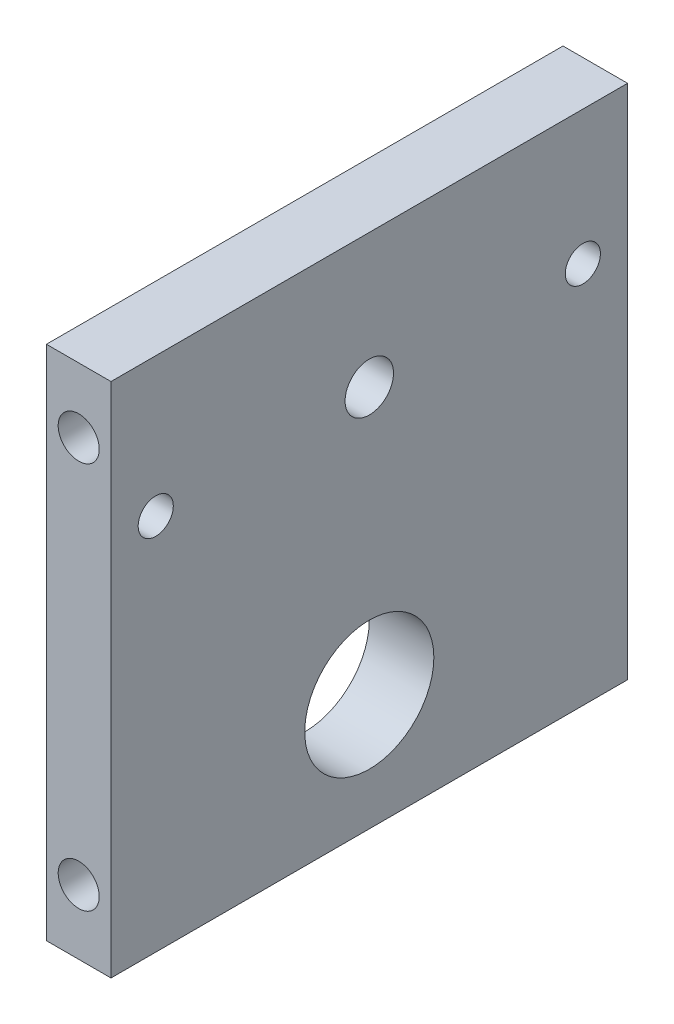
ISO-10303-21;
HEADER;
FILE_DESCRIPTION(('STEP AP214'),'2;1');
FILE_NAME('part.step','',(''),(''),'','','');
FILE_SCHEMA(('AUTOMOTIVE_DESIGN { 1 0 10303 214 1 1 1 1 }'));
ENDSEC;
DATA;
#1=APPLICATION_CONTEXT('core data for automotive mechanical design processes');
#2=APPLICATION_PROTOCOL_DEFINITION('international standard','automotive_design',2000,#1);
#3=PRODUCT_CONTEXT('',#1,'mechanical');
#4=PRODUCT('Part','Part','',(#3));
#5=PRODUCT_RELATED_PRODUCT_CATEGORY('part','',(#4));
#6=PRODUCT_DEFINITION_FORMATION('','',#4);
#7=PRODUCT_DEFINITION_CONTEXT('part definition',#1,'design');
#8=PRODUCT_DEFINITION('design','',#6,#7);
#9=PRODUCT_DEFINITION_SHAPE('','',#8);
#10=(LENGTH_UNIT() NAMED_UNIT(*) SI_UNIT(.MILLI.,.METRE.));
#11=(NAMED_UNIT(*) PLANE_ANGLE_UNIT() SI_UNIT($,.RADIAN.));
#12=(NAMED_UNIT(*) SI_UNIT($,.STERADIAN.) SOLID_ANGLE_UNIT());
#13=UNCERTAINTY_MEASURE_WITH_UNIT(LENGTH_MEASURE(1.E-05),#10,'distance_accuracy_value','');
#14=(GEOMETRIC_REPRESENTATION_CONTEXT(3) GLOBAL_UNCERTAINTY_ASSIGNED_CONTEXT((#13)) GLOBAL_UNIT_ASSIGNED_CONTEXT((#10,
#11,#12)) REPRESENTATION_CONTEXT('',''));
#15=CARTESIAN_POINT('',(0.,0.,0.));
#16=DIRECTION('',(0.,0.,1.));
#17=DIRECTION('',(1.,0.,0.));
#18=AXIS2_PLACEMENT_3D('',#15,#16,#17);
#19=CARTESIAN_POINT('',(6.35,-25.4,-25.4));
#20=DIRECTION('',(0.,0.,1.));
#21=DIRECTION('',(1.,0.,0.));
#22=AXIS2_PLACEMENT_3D('',#19,#20,#21);
#23=PLANE('',#22);
#24=DIRECTION('',(0.,1.,0.));
#25=VECTOR('',#24,1.);
#26=CARTESIAN_POINT('',(0.,-25.4,-25.4));
#27=LINE('',#26,#25);
#28=CARTESIAN_POINT('',(0.,-25.4,-25.4));
#29=VERTEX_POINT('',#28);
#30=CARTESIAN_POINT('',(0.,25.4,-25.4));
#31=VERTEX_POINT('',#30);
#32=EDGE_CURVE('E138',#29,#31,#27,.T.);
#33=ORIENTED_EDGE('',*,*,#32,.T.);
#34=DIRECTION('',(-1.,0.,0.));
#35=VECTOR('',#34,1.);
#36=CARTESIAN_POINT('',(6.35,25.4,-25.4));
#37=LINE('',#36,#35);
#38=CARTESIAN_POINT('',(6.35,25.4,-25.4));
#39=VERTEX_POINT('',#38);
#40=EDGE_CURVE('E11',#39,#31,#37,.T.);
#41=ORIENTED_EDGE('',*,*,#40,.F.);
#42=DIRECTION('',(0.,1.,0.));
#43=VECTOR('',#42,1.);
#44=CARTESIAN_POINT('',(6.35,-25.4,-25.4));
#45=LINE('',#44,#43);
#46=CARTESIAN_POINT('',(6.35,-25.4,-25.4));
#47=VERTEX_POINT('',#46);
#48=EDGE_CURVE('E139',#47,#39,#45,.T.);
#49=ORIENTED_EDGE('',*,*,#48,.F.);
#50=DIRECTION('',(-1.,0.,0.));
#51=VECTOR('',#50,1.);
#52=CARTESIAN_POINT('',(6.35,-25.4,-25.4));
#53=LINE('',#52,#51);
#54=EDGE_CURVE('E145',#47,#29,#53,.T.);
#55=ORIENTED_EDGE('',*,*,#54,.T.);
#56=EDGE_LOOP('',(#33,#41,#49,#55));
#57=FACE_BOUND('',#56,.T.);
#58=ADVANCED_FACE('F39',(#57),#23,.F.);
#59=CARTESIAN_POINT('',(6.35,25.4,25.4));
#60=DIRECTION('',(0.,-1.,0.));
#61=DIRECTION('',(0.,0.,-1.));
#62=AXIS2_PLACEMENT_3D('',#59,#60,#61);
#63=PLANE('',#62);
#64=DIRECTION('',(0.,0.,1.));
#65=VECTOR('',#64,1.);
#66=CARTESIAN_POINT('',(0.,25.4,25.4));
#67=LINE('',#66,#65);
#68=CARTESIAN_POINT('',(0.,25.4,25.4));
#69=VERTEX_POINT('',#68);
#70=EDGE_CURVE('E148',#31,#69,#67,.T.);
#71=ORIENTED_EDGE('',*,*,#70,.T.);
#72=DIRECTION('',(-1.,0.,0.));
#73=VECTOR('',#72,1.);
#74=CARTESIAN_POINT('',(6.35,25.4,25.4));
#75=LINE('',#74,#73);
#76=CARTESIAN_POINT('',(6.35,25.4,25.4));
#77=VERTEX_POINT('',#76);
#78=EDGE_CURVE('E47',#77,#69,#75,.T.);
#79=ORIENTED_EDGE('',*,*,#78,.F.);
#80=DIRECTION('',(0.,0.,1.));
#81=VECTOR('',#80,1.);
#82=CARTESIAN_POINT('',(6.35,25.4,25.4));
#83=LINE('',#82,#81);
#84=EDGE_CURVE('E86',#39,#77,#83,.T.);
#85=ORIENTED_EDGE('',*,*,#84,.F.);
#86=ORIENTED_EDGE('',*,*,#40,.T.);
#87=EDGE_LOOP('',(#71,#79,#85,#86));
#88=FACE_BOUND('',#87,.T.);
#89=ADVANCED_FACE('F172',(#88),#63,.F.);
#90=CARTESIAN_POINT('',(6.35,-25.4,25.4));
#91=DIRECTION('',(0.,0.,-1.));
#92=DIRECTION('',(-1.,0.,0.));
#93=AXIS2_PLACEMENT_3D('',#90,#91,#92);
#94=PLANE('',#93);
#95=CARTESIAN_POINT('',(3.17499999999999,-19.05,25.4));
#96=DIRECTION('',(0.,0.,1.));
#97=DIRECTION('',(1.,0.,0.));
#98=AXIS2_PLACEMENT_3D('',#95,#96,#97);
#99=CIRCLE('',#98,2.0193);
#100=CARTESIAN_POINT('',(5.19429999999999,-19.05,25.4));
#101=VERTEX_POINT('',#100);
#102=EDGE_CURVE('E104',#101,#101,#99,.T.);
#103=ORIENTED_EDGE('',*,*,#102,.F.);
#104=EDGE_LOOP('',(#103));
#105=FACE_BOUND('',#104,.T.);
#106=CARTESIAN_POINT('',(3.175,19.05,25.4));
#107=DIRECTION('',(0.,0.,1.));
#108=DIRECTION('',(1.,0.,0.));
#109=AXIS2_PLACEMENT_3D('',#106,#107,#108);
#110=CIRCLE('',#109,2.0193);
#111=CARTESIAN_POINT('',(5.1943,19.05,25.4));
#112=VERTEX_POINT('',#111);
#113=EDGE_CURVE('E103',#112,#112,#110,.T.);
#114=ORIENTED_EDGE('',*,*,#113,.F.);
#115=EDGE_LOOP('',(#114));
#116=FACE_BOUND('',#115,.T.);
#117=DIRECTION('',(0.,-1.,0.));
#118=VECTOR('',#117,1.);
#119=CARTESIAN_POINT('',(0.,-25.4,25.4));
#120=LINE('',#119,#118);
#121=CARTESIAN_POINT('',(0.,-25.4,25.4));
#122=VERTEX_POINT('',#121);
#123=EDGE_CURVE('E73',#69,#122,#120,.T.);
#124=ORIENTED_EDGE('',*,*,#123,.T.);
#125=DIRECTION('',(-1.,0.,0.));
#126=VECTOR('',#125,1.);
#127=CARTESIAN_POINT('',(6.35,-25.4,25.4));
#128=LINE('',#127,#126);
#129=CARTESIAN_POINT('',(6.35,-25.4,25.4));
#130=VERTEX_POINT('',#129);
#131=EDGE_CURVE('E153',#130,#122,#128,.T.);
#132=ORIENTED_EDGE('',*,*,#131,.F.);
#133=DIRECTION('',(0.,-1.,0.));
#134=VECTOR('',#133,1.);
#135=CARTESIAN_POINT('',(6.35,-25.4,25.4));
#136=LINE('',#135,#134);
#137=EDGE_CURVE('E142',#77,#130,#136,.T.);
#138=ORIENTED_EDGE('',*,*,#137,.F.);
#139=ORIENTED_EDGE('',*,*,#78,.T.);
#140=EDGE_LOOP('',(#124,#132,#138,#139));
#141=FACE_BOUND('',#140,.T.);
#142=ADVANCED_FACE('F155',(#105,#116,#141),#94,.F.);
#143=CARTESIAN_POINT('',(6.35,-25.4,25.4));
#144=DIRECTION('',(0.,1.,0.));
#145=DIRECTION('',(0.,0.,1.));
#146=AXIS2_PLACEMENT_3D('',#143,#144,#145);
#147=PLANE('',#146);
#148=DIRECTION('',(0.,0.,-1.));
#149=VECTOR('',#148,1.);
#150=CARTESIAN_POINT('',(0.,-25.4,25.4));
#151=LINE('',#150,#149);
#152=EDGE_CURVE('E79',#122,#29,#151,.T.);
#153=ORIENTED_EDGE('',*,*,#152,.T.);
#154=ORIENTED_EDGE('',*,*,#54,.F.);
#155=DIRECTION('',(0.,0.,-1.));
#156=VECTOR('',#155,1.);
#157=CARTESIAN_POINT('',(6.35,-25.4,25.4));
#158=LINE('',#157,#156);
#159=EDGE_CURVE('E55',#130,#47,#158,.T.);
#160=ORIENTED_EDGE('',*,*,#159,.F.);
#161=ORIENTED_EDGE('',*,*,#131,.T.);
#162=EDGE_LOOP('',(#153,#154,#160,#161));
#163=FACE_BOUND('',#162,.T.);
#164=ADVANCED_FACE('F162',(#163),#147,.F.);
#165=CARTESIAN_POINT('',(6.35,0.,0.));
#166=DIRECTION('',(-1.,0.,0.));
#167=DIRECTION('',(0.,0.,1.));
#168=AXIS2_PLACEMENT_3D('',#165,#166,#167);
#169=PLANE('',#168);
#170=CARTESIAN_POINT('',(6.35,12.2301,-21.));
#171=DIRECTION('',(1.,0.,0.));
#172=DIRECTION('',(0.,0.,-1.));
#173=AXIS2_PLACEMENT_3D('',#170,#171,#172);
#174=CIRCLE('',#173,1.72719999999999);
#175=CARTESIAN_POINT('',(6.35,12.2301,-22.7272));
#176=VERTEX_POINT('',#175);
#177=EDGE_CURVE('E114',#176,#176,#174,.T.);
#178=ORIENTED_EDGE('',*,*,#177,.F.);
#179=EDGE_LOOP('',(#178));
#180=FACE_BOUND('',#179,.T.);
#181=CARTESIAN_POINT('',(6.35,11.7414591500542,21.));
#182=DIRECTION('',(1.,0.,0.));
#183=DIRECTION('',(0.,0.,-1.));
#184=AXIS2_PLACEMENT_3D('',#181,#182,#183);
#185=CIRCLE('',#184,1.72719999999999);
#186=CARTESIAN_POINT('',(6.35,11.7414591500542,19.2728));
#187=VERTEX_POINT('',#186);
#188=EDGE_CURVE('E120',#187,#187,#185,.T.);
#189=ORIENTED_EDGE('',*,*,#188,.F.);
#190=EDGE_LOOP('',(#189));
#191=FACE_BOUND('',#190,.T.);
#192=CARTESIAN_POINT('',(6.35,12.2301,0.));
#193=DIRECTION('',(1.,0.,0.));
#194=DIRECTION('',(0.,0.,-1.));
#195=AXIS2_PLACEMENT_3D('',#192,#193,#194);
#196=CIRCLE('',#195,2.38124999999999);
#197=CARTESIAN_POINT('',(6.35,12.2301,-2.38124999999999));
#198=VERTEX_POINT('',#197);
#199=EDGE_CURVE('E126',#198,#198,#196,.T.);
#200=ORIENTED_EDGE('',*,*,#199,.F.);
#201=EDGE_LOOP('',(#200));
#202=FACE_BOUND('',#201,.T.);
#203=CARTESIAN_POINT('',(6.35,-13.97,0.));
#204=DIRECTION('',(1.,0.,0.));
#205=DIRECTION('',(0.,0.,-1.));
#206=AXIS2_PLACEMENT_3D('',#203,#204,#205);
#207=CIRCLE('',#206,6.34999999999999);
#208=CARTESIAN_POINT('',(6.35,-13.97,-6.34999999999999));
#209=VERTEX_POINT('',#208);
#210=EDGE_CURVE('E132',#209,#209,#207,.T.);
#211=ORIENTED_EDGE('',*,*,#210,.F.);
#212=EDGE_LOOP('',(#211));
#213=FACE_BOUND('',#212,.T.);
#214=ORIENTED_EDGE('',*,*,#48,.T.);
#215=ORIENTED_EDGE('',*,*,#84,.T.);
#216=ORIENTED_EDGE('',*,*,#137,.T.);
#217=ORIENTED_EDGE('',*,*,#159,.T.);
#218=EDGE_LOOP('',(#214,#215,#216,#217));
#219=FACE_BOUND('',#218,.T.);
#220=ADVANCED_FACE('F164',(#180,#191,#202,#213,#219),#169,.F.);
#221=CARTESIAN_POINT('',(0.,0.,0.));
#222=DIRECTION('',(-1.,0.,0.));
#223=DIRECTION('',(0.,0.,1.));
#224=AXIS2_PLACEMENT_3D('',#221,#222,#223);
#225=PLANE('',#224);
#226=CARTESIAN_POINT('',(0.,12.2301,-21.));
#227=DIRECTION('',(-1.,0.,0.));
#228=DIRECTION('',(0.,0.,1.));
#229=AXIS2_PLACEMENT_3D('',#226,#227,#228);
#230=CIRCLE('',#229,1.72719999999999);
#231=CARTESIAN_POINT('',(0.,12.2301,-19.2728));
#232=VERTEX_POINT('',#231);
#233=EDGE_CURVE('E117',#232,#232,#230,.T.);
#234=ORIENTED_EDGE('',*,*,#233,.F.);
#235=EDGE_LOOP('',(#234));
#236=FACE_BOUND('',#235,.T.);
#237=CARTESIAN_POINT('',(0.,11.7414591500542,21.));
#238=DIRECTION('',(-1.,0.,0.));
#239=DIRECTION('',(0.,0.,1.));
#240=AXIS2_PLACEMENT_3D('',#237,#238,#239);
#241=CIRCLE('',#240,1.72719999999999);
#242=CARTESIAN_POINT('',(0.,11.7414591500542,22.7272));
#243=VERTEX_POINT('',#242);
#244=EDGE_CURVE('E123',#243,#243,#241,.T.);
#245=ORIENTED_EDGE('',*,*,#244,.F.);
#246=EDGE_LOOP('',(#245));
#247=FACE_BOUND('',#246,.T.);
#248=CARTESIAN_POINT('',(0.,12.2301,0.));
#249=DIRECTION('',(-1.,0.,0.));
#250=DIRECTION('',(0.,0.,1.));
#251=AXIS2_PLACEMENT_3D('',#248,#249,#250);
#252=CIRCLE('',#251,2.38124999999999);
#253=CARTESIAN_POINT('',(0.,12.2301,2.38124999999999));
#254=VERTEX_POINT('',#253);
#255=EDGE_CURVE('E129',#254,#254,#252,.T.);
#256=ORIENTED_EDGE('',*,*,#255,.F.);
#257=EDGE_LOOP('',(#256));
#258=FACE_BOUND('',#257,.T.);
#259=CARTESIAN_POINT('',(0.,-13.97,0.));
#260=DIRECTION('',(-1.,0.,0.));
#261=DIRECTION('',(0.,0.,1.));
#262=AXIS2_PLACEMENT_3D('',#259,#260,#261);
#263=CIRCLE('',#262,6.34999999999999);
#264=CARTESIAN_POINT('',(0.,-13.97,6.34999999999998));
#265=VERTEX_POINT('',#264);
#266=EDGE_CURVE('E135',#265,#265,#263,.T.);
#267=ORIENTED_EDGE('',*,*,#266,.F.);
#268=EDGE_LOOP('',(#267));
#269=FACE_BOUND('',#268,.T.);
#270=ORIENTED_EDGE('',*,*,#32,.F.);
#271=ORIENTED_EDGE('',*,*,#152,.F.);
#272=ORIENTED_EDGE('',*,*,#123,.F.);
#273=ORIENTED_EDGE('',*,*,#70,.F.);
#274=EDGE_LOOP('',(#270,#271,#272,#273));
#275=FACE_BOUND('',#274,.T.);
#276=ADVANCED_FACE('F158',(#236,#247,#258,#269,#275),#225,.T.);
#277=CARTESIAN_POINT('',(6.35,-13.97,0.));
#278=DIRECTION('',(1.,0.,0.));
#279=DIRECTION('',(0.,0.,-1.));
#280=AXIS2_PLACEMENT_3D('',#277,#278,#279);
#281=CYLINDRICAL_SURFACE('',#280,6.34999999999999);
#282=ORIENTED_EDGE('',*,*,#266,.T.);
#283=EDGE_LOOP('',(#282));
#284=FACE_BOUND('',#283,.T.);
#285=ORIENTED_EDGE('',*,*,#210,.T.);
#286=EDGE_LOOP('',(#285));
#287=FACE_BOUND('',#286,.T.);
#288=ADVANCED_FACE('F260',(#284,#287),#281,.F.);
#289=CARTESIAN_POINT('',(6.35,12.2301,0.));
#290=DIRECTION('',(1.,0.,0.));
#291=DIRECTION('',(0.,0.,-1.));
#292=AXIS2_PLACEMENT_3D('',#289,#290,#291);
#293=CYLINDRICAL_SURFACE('',#292,2.38124999999999);
#294=ORIENTED_EDGE('',*,*,#255,.T.);
#295=EDGE_LOOP('',(#294));
#296=FACE_BOUND('',#295,.T.);
#297=ORIENTED_EDGE('',*,*,#199,.T.);
#298=EDGE_LOOP('',(#297));
#299=FACE_BOUND('',#298,.T.);
#300=ADVANCED_FACE('F256',(#296,#299),#293,.F.);
#301=CARTESIAN_POINT('',(6.35,11.7414591500542,21.));
#302=DIRECTION('',(1.,0.,0.));
#303=DIRECTION('',(0.,0.,-1.));
#304=AXIS2_PLACEMENT_3D('',#301,#302,#303);
#305=CYLINDRICAL_SURFACE('',#304,1.72719999999999);
#306=ORIENTED_EDGE('',*,*,#244,.T.);
#307=EDGE_LOOP('',(#306));
#308=FACE_BOUND('',#307,.T.);
#309=ORIENTED_EDGE('',*,*,#188,.T.);
#310=EDGE_LOOP('',(#309));
#311=FACE_BOUND('',#310,.T.);
#312=ADVANCED_FACE('F252',(#308,#311),#305,.F.);
#313=CARTESIAN_POINT('',(6.35,12.2301,-21.));
#314=DIRECTION('',(1.,0.,0.));
#315=DIRECTION('',(0.,0.,-1.));
#316=AXIS2_PLACEMENT_3D('',#313,#314,#315);
#317=CYLINDRICAL_SURFACE('',#316,1.72719999999999);
#318=ORIENTED_EDGE('',*,*,#233,.T.);
#319=EDGE_LOOP('',(#318));
#320=FACE_BOUND('',#319,.T.);
#321=ORIENTED_EDGE('',*,*,#177,.T.);
#322=EDGE_LOOP('',(#321));
#323=FACE_BOUND('',#322,.T.);
#324=ADVANCED_FACE('F193',(#320,#323),#317,.F.);
#325=CARTESIAN_POINT('',(3.175,19.05,13.462));
#326=DIRECTION('',(0.,0.,1.));
#327=DIRECTION('',(1.,0.,0.));
#328=AXIS2_PLACEMENT_3D('',#325,#326,#327);
#329=CONICAL_SURFACE('',#328,2.01929999999999,1.02974425867665);
#330=CARTESIAN_POINT('',(3.175,19.05,12.2486821519977));
#331=VERTEX_POINT('',#330);
#332=VERTEX_LOOP('',#331);
#333=FACE_BOUND('',#332,.T.);
#334=CARTESIAN_POINT('',(3.175,19.05,13.462));
#335=DIRECTION('',(0.,0.,1.));
#336=DIRECTION('',(1.,0.,0.));
#337=AXIS2_PLACEMENT_3D('',#334,#335,#336);
#338=CIRCLE('',#337,2.01929999999999);
#339=CARTESIAN_POINT('',(5.1943,19.05,13.462));
#340=VERTEX_POINT('',#339);
#341=EDGE_CURVE('E107',#340,#340,#338,.T.);
#342=ORIENTED_EDGE('',*,*,#341,.T.);
#343=EDGE_LOOP('',(#342));
#344=FACE_BOUND('',#343,.T.);
#345=ADVANCED_FACE('F198',(#333,#344),#329,.F.);
#346=CARTESIAN_POINT('',(3.175,19.05,25.4));
#347=DIRECTION('',(0.,0.,1.));
#348=DIRECTION('',(1.,0.,0.));
#349=AXIS2_PLACEMENT_3D('',#346,#347,#348);
#350=CYLINDRICAL_SURFACE('',#349,2.0193);
#351=ORIENTED_EDGE('',*,*,#341,.F.);
#352=EDGE_LOOP('',(#351));
#353=FACE_BOUND('',#352,.T.);
#354=ORIENTED_EDGE('',*,*,#113,.T.);
#355=EDGE_LOOP('',(#354));
#356=FACE_BOUND('',#355,.T.);
#357=ADVANCED_FACE('F97',(#353,#356),#350,.F.);
#358=CARTESIAN_POINT('',(3.17499999999999,-19.05,13.462));
#359=DIRECTION('',(0.,0.,1.));
#360=DIRECTION('',(1.,0.,0.));
#361=AXIS2_PLACEMENT_3D('',#358,#359,#360);
#362=CONICAL_SURFACE('',#361,2.0193,1.02974425867665);
#363=CARTESIAN_POINT('',(3.17499999999999,-19.05,12.2486821519977));
#364=VERTEX_POINT('',#363);
#365=VERTEX_LOOP('',#364);
#366=FACE_BOUND('',#365,.T.);
#367=CARTESIAN_POINT('',(3.17499999999999,-19.05,13.462));
#368=DIRECTION('',(0.,0.,1.));
#369=DIRECTION('',(1.,0.,0.));
#370=AXIS2_PLACEMENT_3D('',#367,#368,#369);
#371=CIRCLE('',#370,2.0193);
#372=CARTESIAN_POINT('',(5.19429999999999,-19.05,13.462));
#373=VERTEX_POINT('',#372);
#374=EDGE_CURVE('E101',#373,#373,#371,.T.);
#375=ORIENTED_EDGE('',*,*,#374,.T.);
#376=EDGE_LOOP('',(#375));
#377=FACE_BOUND('',#376,.T.);
#378=ADVANCED_FACE('F93',(#366,#377),#362,.F.);
#379=CARTESIAN_POINT('',(3.17499999999999,-19.05,25.4));
#380=DIRECTION('',(0.,0.,1.));
#381=DIRECTION('',(1.,0.,0.));
#382=AXIS2_PLACEMENT_3D('',#379,#380,#381);
#383=CYLINDRICAL_SURFACE('',#382,2.0193);
#384=ORIENTED_EDGE('',*,*,#374,.F.);
#385=EDGE_LOOP('',(#384));
#386=FACE_BOUND('',#385,.T.);
#387=ORIENTED_EDGE('',*,*,#102,.T.);
#388=EDGE_LOOP('',(#387));
#389=FACE_BOUND('',#388,.T.);
#390=ADVANCED_FACE('F96',(#386,#389),#383,.F.);
#391=CLOSED_SHELL('',(#58,#89,#142,#164,#220,#276,#288,#300,#312,#324,#345,#357,#378,#390));
#392=MANIFOLD_SOLID_BREP('B2',#391);
#393=ADVANCED_BREP_SHAPE_REPRESENTATION('',(#18,#392),#14);
#394=SHAPE_DEFINITION_REPRESENTATION(#9,#393);
ENDSEC;
END-ISO-10303-21;
